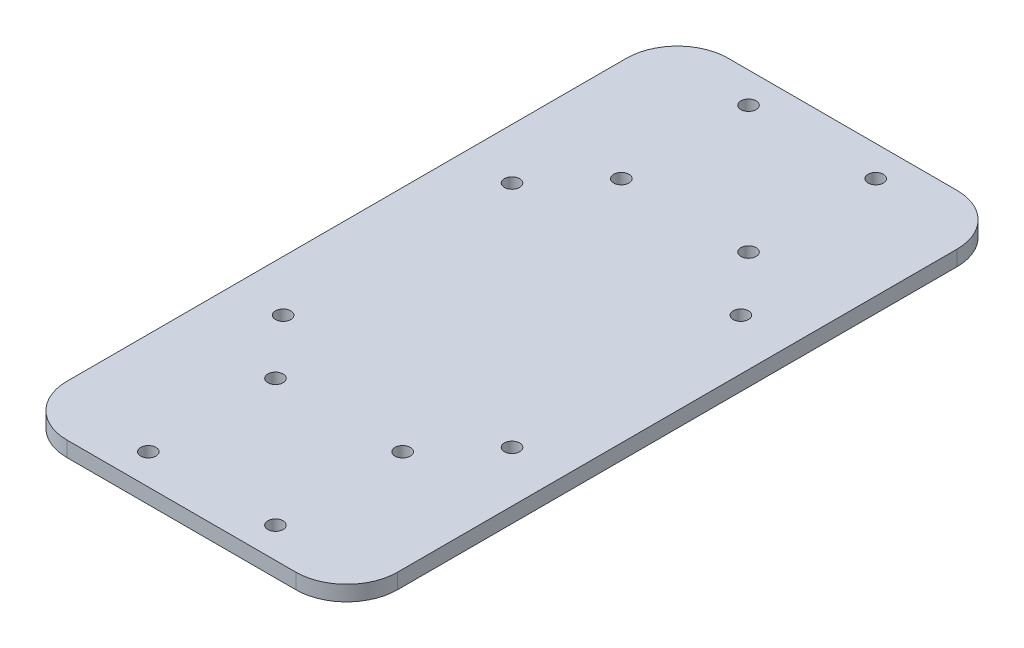
ISO-10303-21;
HEADER;
FILE_DESCRIPTION(('STEP AP214'),'2;1');
FILE_NAME('part.step','',(''),(''),'','','');
FILE_SCHEMA(('AUTOMOTIVE_DESIGN { 1 0 10303 214 1 1 1 1 }'));
ENDSEC;
DATA;
#1=APPLICATION_CONTEXT('core data for automotive mechanical design processes');
#2=APPLICATION_PROTOCOL_DEFINITION('international standard','automotive_design',2000,#1);
#3=PRODUCT_CONTEXT('',#1,'mechanical');
#4=PRODUCT('Part','Part','',(#3));
#5=PRODUCT_RELATED_PRODUCT_CATEGORY('part','',(#4));
#6=PRODUCT_DEFINITION_FORMATION('','',#4);
#7=PRODUCT_DEFINITION_CONTEXT('part definition',#1,'design');
#8=PRODUCT_DEFINITION('design','',#6,#7);
#9=PRODUCT_DEFINITION_SHAPE('','',#8);
#10=(LENGTH_UNIT() NAMED_UNIT(*) SI_UNIT(.MILLI.,.METRE.));
#11=(NAMED_UNIT(*) PLANE_ANGLE_UNIT() SI_UNIT($,.RADIAN.));
#12=(NAMED_UNIT(*) SI_UNIT($,.STERADIAN.) SOLID_ANGLE_UNIT());
#13=UNCERTAINTY_MEASURE_WITH_UNIT(LENGTH_MEASURE(1.E-05),#10,'distance_accuracy_value','');
#14=(GEOMETRIC_REPRESENTATION_CONTEXT(3) GLOBAL_UNCERTAINTY_ASSIGNED_CONTEXT((#13)) GLOBAL_UNIT_ASSIGNED_CONTEXT((#10,
#11,#12)) REPRESENTATION_CONTEXT('',''));
#15=CARTESIAN_POINT('',(0.,0.,0.));
#16=DIRECTION('',(0.,0.,1.));
#17=DIRECTION('',(1.,0.,0.));
#18=AXIS2_PLACEMENT_3D('',#15,#16,#17);
#19=CARTESIAN_POINT('',(0.,3.,0.));
#20=DIRECTION('',(0.,1.,0.));
#21=DIRECTION('',(0.,0.,1.));
#22=AXIS2_PLACEMENT_3D('',#19,#20,#21);
#23=PLANE('',#22);
#24=CARTESIAN_POINT('',(-12.5,3.,34.));
#25=DIRECTION('',(0.,-1.,0.));
#26=DIRECTION('',(0.,0.,-1.));
#27=AXIS2_PLACEMENT_3D('',#24,#25,#26);
#28=CIRCLE('',#27,1.5);
#29=CARTESIAN_POINT('',(-12.5,3.,32.5));
#30=VERTEX_POINT('',#29);
#31=EDGE_CURVE('E240',#30,#30,#28,.T.);
#32=ORIENTED_EDGE('',*,*,#31,.T.);
#33=EDGE_LOOP('',(#32));
#34=FACE_BOUND('',#33,.T.);
#35=CARTESIAN_POINT('',(12.5,3.,34.));
#36=DIRECTION('',(0.,-1.,0.));
#37=DIRECTION('',(0.,0.,-1.));
#38=AXIS2_PLACEMENT_3D('',#35,#36,#37);
#39=CIRCLE('',#38,1.5);
#40=CARTESIAN_POINT('',(12.5,3.,32.5));
#41=VERTEX_POINT('',#40);
#42=EDGE_CURVE('E246',#41,#41,#39,.T.);
#43=ORIENTED_EDGE('',*,*,#42,.T.);
#44=EDGE_LOOP('',(#43));
#45=FACE_BOUND('',#44,.T.);
#46=CARTESIAN_POINT('',(12.5,3.,59.));
#47=DIRECTION('',(0.,-1.,0.));
#48=DIRECTION('',(0.,0.,-1.));
#49=AXIS2_PLACEMENT_3D('',#46,#47,#48);
#50=CIRCLE('',#49,1.5);
#51=CARTESIAN_POINT('',(12.5,3.,57.5));
#52=VERTEX_POINT('',#51);
#53=EDGE_CURVE('E234',#52,#52,#50,.T.);
#54=ORIENTED_EDGE('',*,*,#53,.T.);
#55=EDGE_LOOP('',(#54));
#56=FACE_BOUND('',#55,.T.);
#57=CARTESIAN_POINT('',(-12.5,3.,59.));
#58=DIRECTION('',(0.,-1.,0.));
#59=DIRECTION('',(0.,0.,-1.));
#60=AXIS2_PLACEMENT_3D('',#57,#58,#59);
#61=CIRCLE('',#60,1.5);
#62=CARTESIAN_POINT('',(-12.5,3.,57.5));
#63=VERTEX_POINT('',#62);
#64=EDGE_CURVE('E217',#63,#63,#61,.T.);
#65=ORIENTED_EDGE('',*,*,#64,.T.);
#66=EDGE_LOOP('',(#65));
#67=FACE_BOUND('',#66,.T.);
#68=CARTESIAN_POINT('',(-12.5,3.,-34.));
#69=DIRECTION('',(0.,1.,0.));
#70=DIRECTION('',(0.,0.,1.));
#71=AXIS2_PLACEMENT_3D('',#68,#69,#70);
#72=CIRCLE('',#71,1.5);
#73=CARTESIAN_POINT('',(-12.5,3.,-32.5));
#74=VERTEX_POINT('',#73);
#75=EDGE_CURVE('E216',#74,#74,#72,.T.);
#76=ORIENTED_EDGE('',*,*,#75,.F.);
#77=EDGE_LOOP('',(#76));
#78=FACE_BOUND('',#77,.T.);
#79=CARTESIAN_POINT('',(12.5,3.,-34.));
#80=DIRECTION('',(0.,1.,0.));
#81=DIRECTION('',(0.,0.,1.));
#82=AXIS2_PLACEMENT_3D('',#79,#80,#81);
#83=CIRCLE('',#82,1.5);
#84=CARTESIAN_POINT('',(12.5,3.,-32.5));
#85=VERTEX_POINT('',#84);
#86=EDGE_CURVE('E223',#85,#85,#83,.T.);
#87=ORIENTED_EDGE('',*,*,#86,.F.);
#88=EDGE_LOOP('',(#87));
#89=FACE_BOUND('',#88,.T.);
#90=CARTESIAN_POINT('',(12.5,3.,-59.));
#91=DIRECTION('',(0.,1.,0.));
#92=DIRECTION('',(0.,0.,1.));
#93=AXIS2_PLACEMENT_3D('',#90,#91,#92);
#94=CIRCLE('',#93,1.5);
#95=CARTESIAN_POINT('',(12.5,3.,-57.5));
#96=VERTEX_POINT('',#95);
#97=EDGE_CURVE('E210',#96,#96,#94,.T.);
#98=ORIENTED_EDGE('',*,*,#97,.F.);
#99=EDGE_LOOP('',(#98));
#100=FACE_BOUND('',#99,.T.);
#101=CARTESIAN_POINT('',(-12.5,3.,-59.));
#102=DIRECTION('',(0.,1.,0.));
#103=DIRECTION('',(0.,0.,1.));
#104=AXIS2_PLACEMENT_3D('',#101,#102,#103);
#105=CIRCLE('',#104,1.5);
#106=CARTESIAN_POINT('',(-12.5,3.,-57.5));
#107=VERTEX_POINT('',#106);
#108=EDGE_CURVE('E204',#107,#107,#105,.T.);
#109=ORIENTED_EDGE('',*,*,#108,.F.);
#110=EDGE_LOOP('',(#109));
#111=FACE_BOUND('',#110,.T.);
#112=CARTESIAN_POINT('',(-22.5,3.,22.5));
#113=DIRECTION('',(0.,1.,0.));
#114=DIRECTION('',(0.,0.,-1.));
#115=AXIS2_PLACEMENT_3D('',#112,#113,#114);
#116=CIRCLE('',#115,1.5);
#117=CARTESIAN_POINT('',(-22.5,3.,21.));
#118=VERTEX_POINT('',#117);
#119=EDGE_CURVE('E192',#118,#118,#116,.T.);
#120=ORIENTED_EDGE('',*,*,#119,.F.);
#121=EDGE_LOOP('',(#120));
#122=FACE_BOUND('',#121,.T.);
#123=CARTESIAN_POINT('',(-22.5,3.,-22.5));
#124=DIRECTION('',(0.,1.,0.));
#125=DIRECTION('',(0.,0.,1.));
#126=AXIS2_PLACEMENT_3D('',#123,#124,#125);
#127=CIRCLE('',#126,1.5);
#128=CARTESIAN_POINT('',(-22.5,3.,-21.));
#129=VERTEX_POINT('',#128);
#130=EDGE_CURVE('E133',#129,#129,#127,.T.);
#131=ORIENTED_EDGE('',*,*,#130,.F.);
#132=EDGE_LOOP('',(#131));
#133=FACE_BOUND('',#132,.T.);
#134=DIRECTION('',(0.,0.,-1.));
#135=VECTOR('',#134,1.);
#136=CARTESIAN_POINT('',(32.5,3.,65.));
#137=LINE('',#136,#135);
#138=CARTESIAN_POINT('',(32.5,3.,55.));
#139=VERTEX_POINT('',#138);
#140=CARTESIAN_POINT('',(32.5,3.,-55.));
#141=VERTEX_POINT('',#140);
#142=EDGE_CURVE('E142',#139,#141,#137,.T.);
#143=ORIENTED_EDGE('',*,*,#142,.T.);
#144=CARTESIAN_POINT('',(22.5,3.,-55.));
#145=DIRECTION('',(0.,1.,0.));
#146=DIRECTION('',(0.,0.,1.));
#147=AXIS2_PLACEMENT_3D('',#144,#145,#146);
#148=CIRCLE('',#147,10.);
#149=CARTESIAN_POINT('',(22.5,3.,-65.));
#150=VERTEX_POINT('',#149);
#151=EDGE_CURVE('E161',#141,#150,#148,.T.);
#152=ORIENTED_EDGE('',*,*,#151,.T.);
#153=DIRECTION('',(-1.,0.,0.));
#154=VECTOR('',#153,1.);
#155=CARTESIAN_POINT('',(32.5,3.,-65.));
#156=LINE('',#155,#154);
#157=CARTESIAN_POINT('',(-22.5,3.,-65.));
#158=VERTEX_POINT('',#157);
#159=EDGE_CURVE('E125',#150,#158,#156,.T.);
#160=ORIENTED_EDGE('',*,*,#159,.T.);
#161=CARTESIAN_POINT('',(-22.5,3.,-55.));
#162=DIRECTION('',(0.,1.,0.));
#163=DIRECTION('',(0.,0.,1.));
#164=AXIS2_PLACEMENT_3D('',#161,#162,#163);
#165=CIRCLE('',#164,10.);
#166=CARTESIAN_POINT('',(-32.5,3.,-55.));
#167=VERTEX_POINT('',#166);
#168=EDGE_CURVE('E159',#158,#167,#165,.T.);
#169=ORIENTED_EDGE('',*,*,#168,.T.);
#170=DIRECTION('',(0.,0.,1.));
#171=VECTOR('',#170,1.);
#172=CARTESIAN_POINT('',(-32.5,3.,-65.));
#173=LINE('',#172,#171);
#174=CARTESIAN_POINT('',(-32.5,3.,55.));
#175=VERTEX_POINT('',#174);
#176=EDGE_CURVE('E172',#167,#175,#173,.T.);
#177=ORIENTED_EDGE('',*,*,#176,.T.);
#178=CARTESIAN_POINT('',(-22.5,3.,55.));
#179=DIRECTION('',(0.,1.,0.));
#180=DIRECTION('',(0.,0.,1.));
#181=AXIS2_PLACEMENT_3D('',#178,#179,#180);
#182=CIRCLE('',#181,10.);
#183=CARTESIAN_POINT('',(-22.5,3.,65.));
#184=VERTEX_POINT('',#183);
#185=EDGE_CURVE('E60',#175,#184,#182,.T.);
#186=ORIENTED_EDGE('',*,*,#185,.T.);
#187=DIRECTION('',(1.,0.,0.));
#188=VECTOR('',#187,1.);
#189=CARTESIAN_POINT('',(32.5,3.,65.));
#190=LINE('',#189,#188);
#191=CARTESIAN_POINT('',(22.5,3.,65.));
#192=VERTEX_POINT('',#191);
#193=EDGE_CURVE('E180',#184,#192,#190,.T.);
#194=ORIENTED_EDGE('',*,*,#193,.T.);
#195=CARTESIAN_POINT('',(22.5,3.,55.));
#196=DIRECTION('',(0.,1.,0.));
#197=DIRECTION('',(0.,0.,1.));
#198=AXIS2_PLACEMENT_3D('',#195,#196,#197);
#199=CIRCLE('',#198,10.);
#200=EDGE_CURVE('E156',#192,#139,#199,.T.);
#201=ORIENTED_EDGE('',*,*,#200,.T.);
#202=EDGE_LOOP('',(#143,#152,#160,#169,#177,#186,#194,#201));
#203=FACE_BOUND('',#202,.T.);
#204=CARTESIAN_POINT('',(22.5,3.,-22.5));
#205=DIRECTION('',(0.,1.,0.));
#206=DIRECTION('',(0.,0.,1.));
#207=AXIS2_PLACEMENT_3D('',#204,#205,#206);
#208=CIRCLE('',#207,1.5);
#209=CARTESIAN_POINT('',(22.5,3.,-21.));
#210=VERTEX_POINT('',#209);
#211=EDGE_CURVE('E187',#210,#210,#208,.T.);
#212=ORIENTED_EDGE('',*,*,#211,.F.);
#213=EDGE_LOOP('',(#212));
#214=FACE_BOUND('',#213,.T.);
#215=CARTESIAN_POINT('',(22.5,3.,22.5));
#216=DIRECTION('',(0.,1.,0.));
#217=DIRECTION('',(0.,0.,-1.));
#218=AXIS2_PLACEMENT_3D('',#215,#216,#217);
#219=CIRCLE('',#218,1.5);
#220=CARTESIAN_POINT('',(22.5,3.,21.));
#221=VERTEX_POINT('',#220);
#222=EDGE_CURVE('E198',#221,#221,#219,.T.);
#223=ORIENTED_EDGE('',*,*,#222,.F.);
#224=EDGE_LOOP('',(#223));
#225=FACE_BOUND('',#224,.T.);
#226=ADVANCED_FACE('F39',(#34,#45,#56,#67,#78,#89,#100,#111,#122,#133,#203,#214,#225),#23,.T.);
#227=CARTESIAN_POINT('',(0.,0.,0.));
#228=DIRECTION('',(0.,1.,0.));
#229=DIRECTION('',(0.,0.,1.));
#230=AXIS2_PLACEMENT_3D('',#227,#228,#229);
#231=PLANE('',#230);
#232=CARTESIAN_POINT('',(-12.5,0.,34.));
#233=DIRECTION('',(0.,-1.,0.));
#234=DIRECTION('',(0.,0.,-1.));
#235=AXIS2_PLACEMENT_3D('',#232,#233,#234);
#236=CIRCLE('',#235,1.5);
#237=CARTESIAN_POINT('',(-12.5,0.,32.5));
#238=VERTEX_POINT('',#237);
#239=EDGE_CURVE('E237',#238,#238,#236,.T.);
#240=ORIENTED_EDGE('',*,*,#239,.F.);
#241=EDGE_LOOP('',(#240));
#242=FACE_BOUND('',#241,.T.);
#243=CARTESIAN_POINT('',(12.5,0.,34.));
#244=DIRECTION('',(0.,-1.,0.));
#245=DIRECTION('',(0.,0.,-1.));
#246=AXIS2_PLACEMENT_3D('',#243,#244,#245);
#247=CIRCLE('',#246,1.5);
#248=CARTESIAN_POINT('',(12.5,0.,32.5));
#249=VERTEX_POINT('',#248);
#250=EDGE_CURVE('E243',#249,#249,#247,.T.);
#251=ORIENTED_EDGE('',*,*,#250,.F.);
#252=EDGE_LOOP('',(#251));
#253=FACE_BOUND('',#252,.T.);
#254=CARTESIAN_POINT('',(12.5,0.,59.));
#255=DIRECTION('',(0.,-1.,0.));
#256=DIRECTION('',(0.,0.,-1.));
#257=AXIS2_PLACEMENT_3D('',#254,#255,#256);
#258=CIRCLE('',#257,1.5);
#259=CARTESIAN_POINT('',(12.5,0.,57.5));
#260=VERTEX_POINT('',#259);
#261=EDGE_CURVE('E249',#260,#260,#258,.T.);
#262=ORIENTED_EDGE('',*,*,#261,.F.);
#263=EDGE_LOOP('',(#262));
#264=FACE_BOUND('',#263,.T.);
#265=CARTESIAN_POINT('',(-12.5,0.,59.));
#266=DIRECTION('',(0.,-1.,0.));
#267=DIRECTION('',(0.,0.,-1.));
#268=AXIS2_PLACEMENT_3D('',#265,#266,#267);
#269=CIRCLE('',#268,1.5);
#270=CARTESIAN_POINT('',(-12.5,0.,57.5));
#271=VERTEX_POINT('',#270);
#272=EDGE_CURVE('E231',#271,#271,#269,.T.);
#273=ORIENTED_EDGE('',*,*,#272,.F.);
#274=EDGE_LOOP('',(#273));
#275=FACE_BOUND('',#274,.T.);
#276=CARTESIAN_POINT('',(-12.5,0.,-34.));
#277=DIRECTION('',(0.,1.,0.));
#278=DIRECTION('',(0.,0.,1.));
#279=AXIS2_PLACEMENT_3D('',#276,#277,#278);
#280=CIRCLE('',#279,1.5);
#281=CARTESIAN_POINT('',(-12.5,0.,-32.5));
#282=VERTEX_POINT('',#281);
#283=EDGE_CURVE('E213',#282,#282,#280,.T.);
#284=ORIENTED_EDGE('',*,*,#283,.T.);
#285=EDGE_LOOP('',(#284));
#286=FACE_BOUND('',#285,.T.);
#287=CARTESIAN_POINT('',(12.5,0.,-34.));
#288=DIRECTION('',(0.,1.,0.));
#289=DIRECTION('',(0.,0.,1.));
#290=AXIS2_PLACEMENT_3D('',#287,#288,#289);
#291=CIRCLE('',#290,1.5);
#292=CARTESIAN_POINT('',(12.5,0.,-32.5));
#293=VERTEX_POINT('',#292);
#294=EDGE_CURVE('E220',#293,#293,#291,.T.);
#295=ORIENTED_EDGE('',*,*,#294,.T.);
#296=EDGE_LOOP('',(#295));
#297=FACE_BOUND('',#296,.T.);
#298=CARTESIAN_POINT('',(12.5,0.,-59.));
#299=DIRECTION('',(0.,1.,0.));
#300=DIRECTION('',(0.,0.,1.));
#301=AXIS2_PLACEMENT_3D('',#298,#299,#300);
#302=CIRCLE('',#301,1.5);
#303=CARTESIAN_POINT('',(12.5,0.,-57.5));
#304=VERTEX_POINT('',#303);
#305=EDGE_CURVE('E226',#304,#304,#302,.T.);
#306=ORIENTED_EDGE('',*,*,#305,.T.);
#307=EDGE_LOOP('',(#306));
#308=FACE_BOUND('',#307,.T.);
#309=CARTESIAN_POINT('',(-12.5,0.,-59.));
#310=DIRECTION('',(0.,1.,0.));
#311=DIRECTION('',(0.,0.,1.));
#312=AXIS2_PLACEMENT_3D('',#309,#310,#311);
#313=CIRCLE('',#312,1.5);
#314=CARTESIAN_POINT('',(-12.5,0.,-57.5));
#315=VERTEX_POINT('',#314);
#316=EDGE_CURVE('E207',#315,#315,#313,.T.);
#317=ORIENTED_EDGE('',*,*,#316,.T.);
#318=EDGE_LOOP('',(#317));
#319=FACE_BOUND('',#318,.T.);
#320=DIRECTION('',(-1.,0.,0.));
#321=VECTOR('',#320,1.);
#322=CARTESIAN_POINT('',(32.5,0.,-65.));
#323=LINE('',#322,#321);
#324=CARTESIAN_POINT('',(22.5,0.,-65.));
#325=VERTEX_POINT('',#324);
#326=CARTESIAN_POINT('',(-22.5,0.,-65.));
#327=VERTEX_POINT('',#326);
#328=EDGE_CURVE('E122',#325,#327,#323,.T.);
#329=ORIENTED_EDGE('',*,*,#328,.F.);
#330=CARTESIAN_POINT('',(22.5,0.,-55.));
#331=DIRECTION('',(0.,1.,0.));
#332=DIRECTION('',(0.,0.,1.));
#333=AXIS2_PLACEMENT_3D('',#330,#331,#332);
#334=CIRCLE('',#333,10.);
#335=CARTESIAN_POINT('',(32.5,0.,-55.));
#336=VERTEX_POINT('',#335);
#337=EDGE_CURVE('E105',#325,#336,#334,.F.);
#338=ORIENTED_EDGE('',*,*,#337,.T.);
#339=DIRECTION('',(0.,0.,-1.));
#340=VECTOR('',#339,1.);
#341=CARTESIAN_POINT('',(32.5,0.,65.));
#342=LINE('',#341,#340);
#343=CARTESIAN_POINT('',(32.5,0.,55.));
#344=VERTEX_POINT('',#343);
#345=EDGE_CURVE('E146',#344,#336,#342,.T.);
#346=ORIENTED_EDGE('',*,*,#345,.F.);
#347=CARTESIAN_POINT('',(22.5,0.,55.));
#348=DIRECTION('',(0.,1.,0.));
#349=DIRECTION('',(0.,0.,1.));
#350=AXIS2_PLACEMENT_3D('',#347,#348,#349);
#351=CIRCLE('',#350,10.);
#352=CARTESIAN_POINT('',(22.5,0.,65.));
#353=VERTEX_POINT('',#352);
#354=EDGE_CURVE('E126',#344,#353,#351,.F.);
#355=ORIENTED_EDGE('',*,*,#354,.T.);
#356=DIRECTION('',(1.,0.,0.));
#357=VECTOR('',#356,1.);
#358=CARTESIAN_POINT('',(32.5,0.,65.));
#359=LINE('',#358,#357);
#360=CARTESIAN_POINT('',(-22.5,0.,65.));
#361=VERTEX_POINT('',#360);
#362=EDGE_CURVE('E136',#361,#353,#359,.T.);
#363=ORIENTED_EDGE('',*,*,#362,.F.);
#364=CARTESIAN_POINT('',(-22.5,0.,55.));
#365=DIRECTION('',(0.,1.,0.));
#366=DIRECTION('',(0.,0.,1.));
#367=AXIS2_PLACEMENT_3D('',#364,#365,#366);
#368=CIRCLE('',#367,10.);
#369=CARTESIAN_POINT('',(-32.5,0.,55.));
#370=VERTEX_POINT('',#369);
#371=EDGE_CURVE('E150',#361,#370,#368,.F.);
#372=ORIENTED_EDGE('',*,*,#371,.T.);
#373=DIRECTION('',(0.,0.,1.));
#374=VECTOR('',#373,1.);
#375=CARTESIAN_POINT('',(-32.5,0.,-65.));
#376=LINE('',#375,#374);
#377=CARTESIAN_POINT('',(-32.5,0.,-55.));
#378=VERTEX_POINT('',#377);
#379=EDGE_CURVE('E132',#378,#370,#376,.T.);
#380=ORIENTED_EDGE('',*,*,#379,.F.);
#381=CARTESIAN_POINT('',(-22.5,0.,-55.));
#382=DIRECTION('',(0.,1.,0.));
#383=DIRECTION('',(0.,0.,1.));
#384=AXIS2_PLACEMENT_3D('',#381,#382,#383);
#385=CIRCLE('',#384,10.);
#386=EDGE_CURVE('E116',#378,#327,#385,.F.);
#387=ORIENTED_EDGE('',*,*,#386,.T.);
#388=EDGE_LOOP('',(#329,#338,#346,#355,#363,#372,#380,#387));
#389=FACE_BOUND('',#388,.T.);
#390=CARTESIAN_POINT('',(-22.5,0.,-22.5));
#391=DIRECTION('',(0.,1.,0.));
#392=DIRECTION('',(0.,0.,1.));
#393=AXIS2_PLACEMENT_3D('',#390,#391,#392);
#394=CIRCLE('',#393,1.5);
#395=CARTESIAN_POINT('',(-22.5,0.,-21.));
#396=VERTEX_POINT('',#395);
#397=EDGE_CURVE('E139',#396,#396,#394,.T.);
#398=ORIENTED_EDGE('',*,*,#397,.T.);
#399=EDGE_LOOP('',(#398));
#400=FACE_BOUND('',#399,.T.);
#401=CARTESIAN_POINT('',(22.5,0.,-22.5));
#402=DIRECTION('',(0.,1.,0.));
#403=DIRECTION('',(0.,0.,1.));
#404=AXIS2_PLACEMENT_3D('',#401,#402,#403);
#405=CIRCLE('',#404,1.5);
#406=CARTESIAN_POINT('',(22.5,0.,-21.));
#407=VERTEX_POINT('',#406);
#408=EDGE_CURVE('E189',#407,#407,#405,.T.);
#409=ORIENTED_EDGE('',*,*,#408,.T.);
#410=EDGE_LOOP('',(#409));
#411=FACE_BOUND('',#410,.T.);
#412=CARTESIAN_POINT('',(-22.5,0.,22.5));
#413=DIRECTION('',(0.,1.,0.));
#414=DIRECTION('',(0.,0.,-1.));
#415=AXIS2_PLACEMENT_3D('',#412,#413,#414);
#416=CIRCLE('',#415,1.5);
#417=CARTESIAN_POINT('',(-22.5,0.,21.));
#418=VERTEX_POINT('',#417);
#419=EDGE_CURVE('E195',#418,#418,#416,.T.);
#420=ORIENTED_EDGE('',*,*,#419,.T.);
#421=EDGE_LOOP('',(#420));
#422=FACE_BOUND('',#421,.T.);
#423=CARTESIAN_POINT('',(22.5,0.,22.5));
#424=DIRECTION('',(0.,1.,0.));
#425=DIRECTION('',(0.,0.,-1.));
#426=AXIS2_PLACEMENT_3D('',#423,#424,#425);
#427=CIRCLE('',#426,1.5);
#428=CARTESIAN_POINT('',(22.5,0.,21.));
#429=VERTEX_POINT('',#428);
#430=EDGE_CURVE('E201',#429,#429,#427,.T.);
#431=ORIENTED_EDGE('',*,*,#430,.T.);
#432=EDGE_LOOP('',(#431));
#433=FACE_BOUND('',#432,.T.);
#434=ADVANCED_FACE('F129',(#242,#253,#264,#275,#286,#297,#308,#319,#389,#400,#411,#422,#433),
#231,.F.);
#435=CARTESIAN_POINT('',(32.5,3.,-65.));
#436=DIRECTION('',(0.,0.,1.));
#437=DIRECTION('',(1.,0.,0.));
#438=AXIS2_PLACEMENT_3D('',#435,#436,#437);
#439=PLANE('',#438);
#440=ORIENTED_EDGE('',*,*,#159,.F.);
#441=DIRECTION('',(0.,-1.,0.));
#442=VECTOR('',#441,1.);
#443=CARTESIAN_POINT('',(22.5,3.,-65.));
#444=LINE('',#443,#442);
#445=EDGE_CURVE('E109',#150,#325,#444,.T.);
#446=ORIENTED_EDGE('',*,*,#445,.T.);
#447=ORIENTED_EDGE('',*,*,#328,.T.);
#448=DIRECTION('',(0.,-1.,0.));
#449=VECTOR('',#448,1.);
#450=CARTESIAN_POINT('',(-22.5,3.,-65.));
#451=LINE('',#450,#449);
#452=EDGE_CURVE('E127',#327,#158,#451,.F.);
#453=ORIENTED_EDGE('',*,*,#452,.T.);
#454=EDGE_LOOP('',(#440,#446,#447,#453));
#455=FACE_BOUND('',#454,.T.);
#456=ADVANCED_FACE('F121',(#455),#439,.F.);
#457=CARTESIAN_POINT('',(-32.5,3.,-65.));
#458=DIRECTION('',(1.,0.,0.));
#459=DIRECTION('',(0.,0.,-1.));
#460=AXIS2_PLACEMENT_3D('',#457,#458,#459);
#461=PLANE('',#460);
#462=ORIENTED_EDGE('',*,*,#176,.F.);
#463=DIRECTION('',(0.,-1.,0.));
#464=VECTOR('',#463,1.);
#465=CARTESIAN_POINT('',(-32.5,3.,-55.));
#466=LINE('',#465,#464);
#467=EDGE_CURVE('E165',#167,#378,#466,.T.);
#468=ORIENTED_EDGE('',*,*,#467,.T.);
#469=ORIENTED_EDGE('',*,*,#379,.T.);
#470=DIRECTION('',(0.,-1.,0.));
#471=VECTOR('',#470,1.);
#472=CARTESIAN_POINT('',(-32.5,3.,55.));
#473=LINE('',#472,#471);
#474=EDGE_CURVE('E163',#370,#175,#473,.F.);
#475=ORIENTED_EDGE('',*,*,#474,.T.);
#476=EDGE_LOOP('',(#462,#468,#469,#475));
#477=FACE_BOUND('',#476,.T.);
#478=ADVANCED_FACE('F170',(#477),#461,.F.);
#479=CARTESIAN_POINT('',(32.5,3.,65.));
#480=DIRECTION('',(0.,0.,-1.));
#481=DIRECTION('',(-1.,0.,0.));
#482=AXIS2_PLACEMENT_3D('',#479,#480,#481);
#483=PLANE('',#482);
#484=ORIENTED_EDGE('',*,*,#193,.F.);
#485=DIRECTION('',(0.,-1.,0.));
#486=VECTOR('',#485,1.);
#487=CARTESIAN_POINT('',(-22.5,3.,65.));
#488=LINE('',#487,#486);
#489=EDGE_CURVE('E11',#184,#361,#488,.T.);
#490=ORIENTED_EDGE('',*,*,#489,.T.);
#491=ORIENTED_EDGE('',*,*,#362,.T.);
#492=DIRECTION('',(0.,-1.,0.));
#493=VECTOR('',#492,1.);
#494=CARTESIAN_POINT('',(22.5,3.,65.));
#495=LINE('',#494,#493);
#496=EDGE_CURVE('E47',#353,#192,#495,.F.);
#497=ORIENTED_EDGE('',*,*,#496,.T.);
#498=EDGE_LOOP('',(#484,#490,#491,#497));
#499=FACE_BOUND('',#498,.T.);
#500=ADVANCED_FACE('F179',(#499),#483,.F.);
#501=CARTESIAN_POINT('',(32.5,3.,65.));
#502=DIRECTION('',(-1.,0.,0.));
#503=DIRECTION('',(0.,0.,1.));
#504=AXIS2_PLACEMENT_3D('',#501,#502,#503);
#505=PLANE('',#504);
#506=ORIENTED_EDGE('',*,*,#345,.T.);
#507=DIRECTION('',(0.,-1.,0.));
#508=VECTOR('',#507,1.);
#509=CARTESIAN_POINT('',(32.5,3.,-55.));
#510=LINE('',#509,#508);
#511=EDGE_CURVE('E110',#336,#141,#510,.F.);
#512=ORIENTED_EDGE('',*,*,#511,.T.);
#513=ORIENTED_EDGE('',*,*,#142,.F.);
#514=DIRECTION('',(0.,-1.,0.));
#515=VECTOR('',#514,1.);
#516=CARTESIAN_POINT('',(32.5,3.,55.));
#517=LINE('',#516,#515);
#518=EDGE_CURVE('E115',#139,#344,#517,.T.);
#519=ORIENTED_EDGE('',*,*,#518,.T.);
#520=EDGE_LOOP('',(#506,#512,#513,#519));
#521=FACE_BOUND('',#520,.T.);
#522=ADVANCED_FACE('F307',(#521),#505,.F.);
#523=CARTESIAN_POINT('',(-22.5,3.,-22.5));
#524=DIRECTION('',(0.,-1.,0.));
#525=DIRECTION('',(0.,0.,-1.));
#526=AXIS2_PLACEMENT_3D('',#523,#524,#525);
#527=CYLINDRICAL_SURFACE('',#526,1.5);
#528=ORIENTED_EDGE('',*,*,#130,.T.);
#529=EDGE_LOOP('',(#528));
#530=FACE_BOUND('',#529,.T.);
#531=ORIENTED_EDGE('',*,*,#397,.F.);
#532=EDGE_LOOP('',(#531));
#533=FACE_BOUND('',#532,.T.);
#534=ADVANCED_FACE('F304',(#530,#533),#527,.F.);
#535=CARTESIAN_POINT('',(22.5,3.,-22.5));
#536=DIRECTION('',(0.,-1.,0.));
#537=DIRECTION('',(0.,0.,-1.));
#538=AXIS2_PLACEMENT_3D('',#535,#536,#537);
#539=CYLINDRICAL_SURFACE('',#538,1.5);
#540=ORIENTED_EDGE('',*,*,#211,.T.);
#541=EDGE_LOOP('',(#540));
#542=FACE_BOUND('',#541,.T.);
#543=ORIENTED_EDGE('',*,*,#408,.F.);
#544=EDGE_LOOP('',(#543));
#545=FACE_BOUND('',#544,.T.);
#546=ADVANCED_FACE('F339',(#542,#545),#539,.F.);
#547=CARTESIAN_POINT('',(-22.5,3.,22.5));
#548=DIRECTION('',(0.,-1.,0.));
#549=DIRECTION('',(0.,0.,-1.));
#550=AXIS2_PLACEMENT_3D('',#547,#548,#549);
#551=CYLINDRICAL_SURFACE('',#550,1.5);
#552=ORIENTED_EDGE('',*,*,#119,.T.);
#553=EDGE_LOOP('',(#552));
#554=FACE_BOUND('',#553,.T.);
#555=ORIENTED_EDGE('',*,*,#419,.F.);
#556=EDGE_LOOP('',(#555));
#557=FACE_BOUND('',#556,.T.);
#558=ADVANCED_FACE('F292',(#554,#557),#551,.F.);
#559=CARTESIAN_POINT('',(22.5,3.,22.5));
#560=DIRECTION('',(0.,-1.,0.));
#561=DIRECTION('',(0.,0.,-1.));
#562=AXIS2_PLACEMENT_3D('',#559,#560,#561);
#563=CYLINDRICAL_SURFACE('',#562,1.5);
#564=ORIENTED_EDGE('',*,*,#222,.T.);
#565=EDGE_LOOP('',(#564));
#566=FACE_BOUND('',#565,.T.);
#567=ORIENTED_EDGE('',*,*,#430,.F.);
#568=EDGE_LOOP('',(#567));
#569=FACE_BOUND('',#568,.T.);
#570=ADVANCED_FACE('F282',(#566,#569),#563,.F.);
#571=CARTESIAN_POINT('',(-12.5,3.,-59.));
#572=DIRECTION('',(0.,-1.,0.));
#573=DIRECTION('',(0.,0.,-1.));
#574=AXIS2_PLACEMENT_3D('',#571,#572,#573);
#575=CYLINDRICAL_SURFACE('',#574,1.5);
#576=ORIENTED_EDGE('',*,*,#108,.T.);
#577=EDGE_LOOP('',(#576));
#578=FACE_BOUND('',#577,.T.);
#579=ORIENTED_EDGE('',*,*,#316,.F.);
#580=EDGE_LOOP('',(#579));
#581=FACE_BOUND('',#580,.T.);
#582=ADVANCED_FACE('F279',(#578,#581),#575,.F.);
#583=CARTESIAN_POINT('',(12.5,3.,-59.));
#584=DIRECTION('',(0.,-1.,0.));
#585=DIRECTION('',(0.,0.,-1.));
#586=AXIS2_PLACEMENT_3D('',#583,#584,#585);
#587=CYLINDRICAL_SURFACE('',#586,1.5);
#588=ORIENTED_EDGE('',*,*,#97,.T.);
#589=EDGE_LOOP('',(#588));
#590=FACE_BOUND('',#589,.T.);
#591=ORIENTED_EDGE('',*,*,#305,.F.);
#592=EDGE_LOOP('',(#591));
#593=FACE_BOUND('',#592,.T.);
#594=ADVANCED_FACE('F281',(#590,#593),#587,.F.);
#595=CARTESIAN_POINT('',(12.5,3.,-34.));
#596=DIRECTION('',(0.,-1.,0.));
#597=DIRECTION('',(0.,0.,-1.));
#598=AXIS2_PLACEMENT_3D('',#595,#596,#597);
#599=CYLINDRICAL_SURFACE('',#598,1.5);
#600=ORIENTED_EDGE('',*,*,#86,.T.);
#601=EDGE_LOOP('',(#600));
#602=FACE_BOUND('',#601,.T.);
#603=ORIENTED_EDGE('',*,*,#294,.F.);
#604=EDGE_LOOP('',(#603));
#605=FACE_BOUND('',#604,.T.);
#606=ADVANCED_FACE('F289',(#602,#605),#599,.F.);
#607=CARTESIAN_POINT('',(-12.5,3.,-34.));
#608=DIRECTION('',(0.,-1.,0.));
#609=DIRECTION('',(0.,0.,-1.));
#610=AXIS2_PLACEMENT_3D('',#607,#608,#609);
#611=CYLINDRICAL_SURFACE('',#610,1.5);
#612=ORIENTED_EDGE('',*,*,#75,.T.);
#613=EDGE_LOOP('',(#612));
#614=FACE_BOUND('',#613,.T.);
#615=ORIENTED_EDGE('',*,*,#283,.F.);
#616=EDGE_LOOP('',(#615));
#617=FACE_BOUND('',#616,.T.);
#618=ADVANCED_FACE('F399',(#614,#617),#611,.F.);
#619=CARTESIAN_POINT('',(-12.5,3.,59.));
#620=DIRECTION('',(0.,-1.,0.));
#621=DIRECTION('',(0.,0.,-1.));
#622=AXIS2_PLACEMENT_3D('',#619,#620,#621);
#623=CYLINDRICAL_SURFACE('',#622,1.5);
#624=ORIENTED_EDGE('',*,*,#64,.F.);
#625=EDGE_LOOP('',(#624));
#626=FACE_BOUND('',#625,.T.);
#627=ORIENTED_EDGE('',*,*,#272,.T.);
#628=EDGE_LOOP('',(#627));
#629=FACE_BOUND('',#628,.T.);
#630=ADVANCED_FACE('F261',(#626,#629),#623,.F.);
#631=CARTESIAN_POINT('',(12.5,3.,59.));
#632=DIRECTION('',(0.,-1.,0.));
#633=DIRECTION('',(0.,0.,-1.));
#634=AXIS2_PLACEMENT_3D('',#631,#632,#633);
#635=CYLINDRICAL_SURFACE('',#634,1.5);
#636=ORIENTED_EDGE('',*,*,#53,.F.);
#637=EDGE_LOOP('',(#636));
#638=FACE_BOUND('',#637,.T.);
#639=ORIENTED_EDGE('',*,*,#261,.T.);
#640=EDGE_LOOP('',(#639));
#641=FACE_BOUND('',#640,.T.);
#642=ADVANCED_FACE('F257',(#638,#641),#635,.F.);
#643=CARTESIAN_POINT('',(12.5,3.,34.));
#644=DIRECTION('',(0.,-1.,0.));
#645=DIRECTION('',(0.,0.,-1.));
#646=AXIS2_PLACEMENT_3D('',#643,#644,#645);
#647=CYLINDRICAL_SURFACE('',#646,1.5);
#648=ORIENTED_EDGE('',*,*,#42,.F.);
#649=EDGE_LOOP('',(#648));
#650=FACE_BOUND('',#649,.T.);
#651=ORIENTED_EDGE('',*,*,#250,.T.);
#652=EDGE_LOOP('',(#651));
#653=FACE_BOUND('',#652,.T.);
#654=ADVANCED_FACE('F260',(#650,#653),#647,.F.);
#655=CARTESIAN_POINT('',(-12.5,3.,34.));
#656=DIRECTION('',(0.,-1.,0.));
#657=DIRECTION('',(0.,0.,-1.));
#658=AXIS2_PLACEMENT_3D('',#655,#656,#657);
#659=CYLINDRICAL_SURFACE('',#658,1.5);
#660=ORIENTED_EDGE('',*,*,#31,.F.);
#661=EDGE_LOOP('',(#660));
#662=FACE_BOUND('',#661,.T.);
#663=ORIENTED_EDGE('',*,*,#239,.T.);
#664=EDGE_LOOP('',(#663));
#665=FACE_BOUND('',#664,.T.);
#666=ADVANCED_FACE('F320',(#662,#665),#659,.F.);
#667=CARTESIAN_POINT('',(22.5,3.,-55.));
#668=DIRECTION('',(0.,-1.,0.));
#669=DIRECTION('',(0.,0.,-1.));
#670=AXIS2_PLACEMENT_3D('',#667,#668,#669);
#671=CYLINDRICAL_SURFACE('',#670,10.);
#672=ORIENTED_EDGE('',*,*,#151,.F.);
#673=ORIENTED_EDGE('',*,*,#511,.F.);
#674=ORIENTED_EDGE('',*,*,#337,.F.);
#675=ORIENTED_EDGE('',*,*,#445,.F.);
#676=EDGE_LOOP('',(#672,#673,#674,#675));
#677=FACE_BOUND('',#676,.T.);
#678=ADVANCED_FACE('F108',(#677),#671,.T.);
#679=CARTESIAN_POINT('',(-22.5,3.,-55.));
#680=DIRECTION('',(0.,-1.,0.));
#681=DIRECTION('',(0.,0.,-1.));
#682=AXIS2_PLACEMENT_3D('',#679,#680,#681);
#683=CYLINDRICAL_SURFACE('',#682,10.);
#684=ORIENTED_EDGE('',*,*,#168,.F.);
#685=ORIENTED_EDGE('',*,*,#452,.F.);
#686=ORIENTED_EDGE('',*,*,#386,.F.);
#687=ORIENTED_EDGE('',*,*,#467,.F.);
#688=EDGE_LOOP('',(#684,#685,#686,#687));
#689=FACE_BOUND('',#688,.T.);
#690=ADVANCED_FACE('F319',(#689),#683,.T.);
#691=CARTESIAN_POINT('',(-22.5,3.,55.));
#692=DIRECTION('',(0.,-1.,0.));
#693=DIRECTION('',(0.,0.,-1.));
#694=AXIS2_PLACEMENT_3D('',#691,#692,#693);
#695=CYLINDRICAL_SURFACE('',#694,10.);
#696=ORIENTED_EDGE('',*,*,#185,.F.);
#697=ORIENTED_EDGE('',*,*,#474,.F.);
#698=ORIENTED_EDGE('',*,*,#371,.F.);
#699=ORIENTED_EDGE('',*,*,#489,.F.);
#700=EDGE_LOOP('',(#696,#697,#698,#699));
#701=FACE_BOUND('',#700,.T.);
#702=ADVANCED_FACE('F178',(#701),#695,.T.);
#703=CARTESIAN_POINT('',(22.5,3.,55.));
#704=DIRECTION('',(0.,-1.,0.));
#705=DIRECTION('',(0.,0.,-1.));
#706=AXIS2_PLACEMENT_3D('',#703,#704,#705);
#707=CYLINDRICAL_SURFACE('',#706,10.);
#708=ORIENTED_EDGE('',*,*,#200,.F.);
#709=ORIENTED_EDGE('',*,*,#496,.F.);
#710=ORIENTED_EDGE('',*,*,#354,.F.);
#711=ORIENTED_EDGE('',*,*,#518,.F.);
#712=EDGE_LOOP('',(#708,#709,#710,#711));
#713=FACE_BOUND('',#712,.T.);
#714=ADVANCED_FACE('F41',(#713),#707,.T.);
#715=CLOSED_SHELL('',(#226,#434,#456,#478,#500,#522,#534,#546,#558,#570,#582,#594,#606,#618,
#630,#642,#654,#666,#678,#690,#702,#714));
#716=MANIFOLD_SOLID_BREP('B2',#715);
#717=ADVANCED_BREP_SHAPE_REPRESENTATION('',(#18,#716),#14);
#718=SHAPE_DEFINITION_REPRESENTATION(#9,#717);
ENDSEC;
END-ISO-10303-21;
